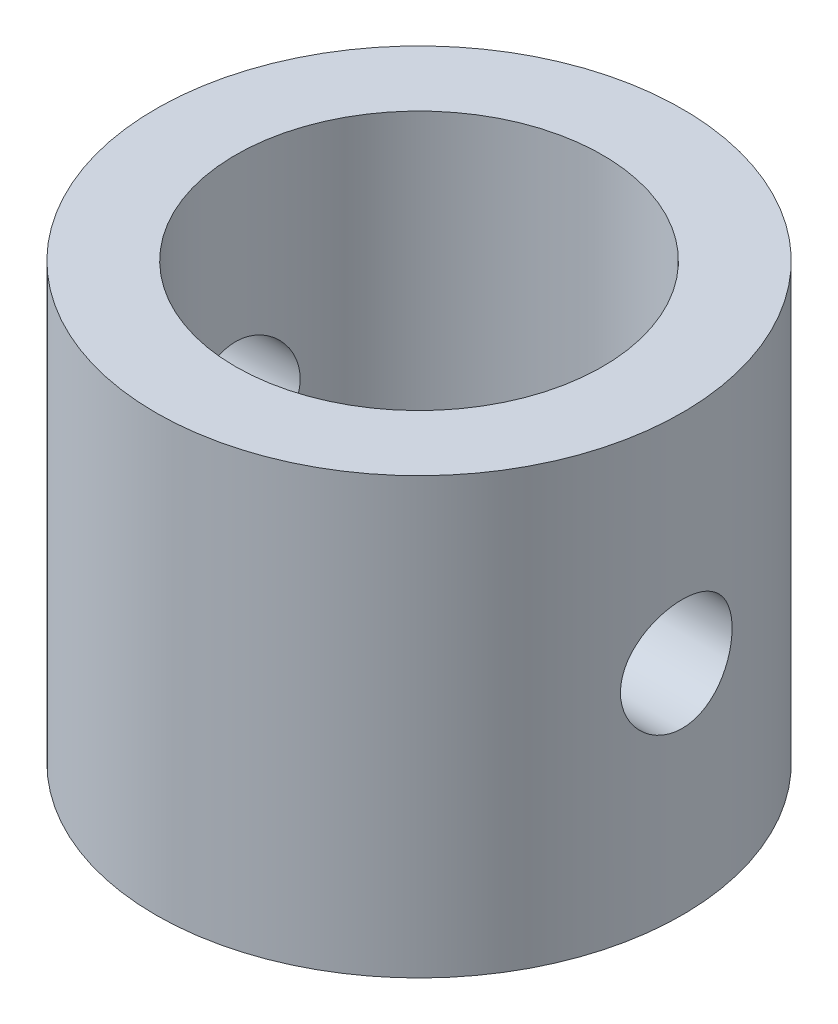
ISO-10303-21;
HEADER;
FILE_DESCRIPTION(('STEP AP214'),'2;1');
FILE_NAME('part.step','',(''),(''),'','','');
FILE_SCHEMA(('AUTOMOTIVE_DESIGN { 1 0 10303 214 1 1 1 1 }'));
ENDSEC;
DATA;
#1=APPLICATION_CONTEXT('core data for automotive mechanical design processes');
#2=APPLICATION_PROTOCOL_DEFINITION('international standard','automotive_design',2000,#1);
#3=PRODUCT_CONTEXT('',#1,'mechanical');
#4=PRODUCT('Part','Part','',(#3));
#5=PRODUCT_RELATED_PRODUCT_CATEGORY('part','',(#4));
#6=PRODUCT_DEFINITION_FORMATION('','',#4);
#7=PRODUCT_DEFINITION_CONTEXT('part definition',#1,'design');
#8=PRODUCT_DEFINITION('design','',#6,#7);
#9=PRODUCT_DEFINITION_SHAPE('','',#8);
#10=(LENGTH_UNIT() NAMED_UNIT(*) SI_UNIT(.MILLI.,.METRE.));
#11=(NAMED_UNIT(*) PLANE_ANGLE_UNIT() SI_UNIT($,.RADIAN.));
#12=(NAMED_UNIT(*) SI_UNIT($,.STERADIAN.) SOLID_ANGLE_UNIT());
#13=UNCERTAINTY_MEASURE_WITH_UNIT(LENGTH_MEASURE(1.E-05),#10,'distance_accuracy_value','');
#14=(GEOMETRIC_REPRESENTATION_CONTEXT(3) GLOBAL_UNCERTAINTY_ASSIGNED_CONTEXT((#13)) GLOBAL_UNIT_ASSIGNED_CONTEXT((#10,
#11,#12)) REPRESENTATION_CONTEXT('',''));
#15=CARTESIAN_POINT('',(0.,0.,0.));
#16=DIRECTION('',(0.,0.,1.));
#17=DIRECTION('',(1.,0.,0.));
#18=AXIS2_PLACEMENT_3D('',#15,#16,#17);
#19=CARTESIAN_POINT('',(0.,38.1,0.));
#20=DIRECTION('',(0.,1.,0.));
#21=DIRECTION('',(0.,0.,1.));
#22=AXIS2_PLACEMENT_3D('',#19,#20,#21);
#23=PLANE('',#22);
#24=CARTESIAN_POINT('',(0.,38.1,0.));
#25=DIRECTION('',(0.,1.,0.));
#26=DIRECTION('',(0.,0.,1.));
#27=AXIS2_PLACEMENT_3D('',#24,#25,#26);
#28=CIRCLE('',#27,23.0505);
#29=CARTESIAN_POINT('',(0.,38.1,23.0505));
#30=VERTEX_POINT('',#29);
#31=EDGE_CURVE('E10',#30,#30,#28,.T.);
#32=ORIENTED_EDGE('',*,*,#31,.T.);
#33=EDGE_LOOP('',(#32));
#34=FACE_BOUND('',#33,.T.);
#35=CARTESIAN_POINT('',(0.,38.1,0.));
#36=DIRECTION('',(0.,1.,0.));
#37=DIRECTION('',(0.,0.,1.));
#38=AXIS2_PLACEMENT_3D('',#35,#36,#37);
#39=CIRCLE('',#38,16.0655);
#40=CARTESIAN_POINT('',(0.,38.1,16.0655));
#41=VERTEX_POINT('',#40);
#42=EDGE_CURVE('E64',#41,#41,#39,.T.);
#43=ORIENTED_EDGE('',*,*,#42,.F.);
#44=EDGE_LOOP('',(#43));
#45=FACE_BOUND('',#44,.T.);
#46=ADVANCED_FACE('F43',(#34,#45),#23,.T.);
#47=CARTESIAN_POINT('',(0.,0.,0.));
#48=DIRECTION('',(0.,1.,0.));
#49=DIRECTION('',(0.,0.,1.));
#50=AXIS2_PLACEMENT_3D('',#47,#48,#49);
#51=PLANE('',#50);
#52=CARTESIAN_POINT('',(0.,0.,0.));
#53=DIRECTION('',(0.,1.,0.));
#54=DIRECTION('',(0.,0.,1.));
#55=AXIS2_PLACEMENT_3D('',#52,#53,#54);
#56=CIRCLE('',#55,23.0505);
#57=CARTESIAN_POINT('',(0.,0.,23.0505));
#58=VERTEX_POINT('',#57);
#59=EDGE_CURVE('E58',#58,#58,#56,.T.);
#60=ORIENTED_EDGE('',*,*,#59,.F.);
#61=EDGE_LOOP('',(#60));
#62=FACE_BOUND('',#61,.T.);
#63=CARTESIAN_POINT('',(0.,0.,0.));
#64=DIRECTION('',(0.,1.,0.));
#65=DIRECTION('',(0.,0.,1.));
#66=AXIS2_PLACEMENT_3D('',#63,#64,#65);
#67=CIRCLE('',#66,16.0655);
#68=CARTESIAN_POINT('',(0.,0.,16.0655));
#69=VERTEX_POINT('',#68);
#70=EDGE_CURVE('E67',#69,#69,#67,.T.);
#71=ORIENTED_EDGE('',*,*,#70,.T.);
#72=EDGE_LOOP('',(#71));
#73=FACE_BOUND('',#72,.T.);
#74=ADVANCED_FACE('F108',(#62,#73),#51,.F.);
#75=CARTESIAN_POINT('',(0.,38.1,0.));
#76=DIRECTION('',(0.,-1.,0.));
#77=DIRECTION('',(0.,0.,-1.));
#78=AXIS2_PLACEMENT_3D('',#75,#76,#77);
#79=CYLINDRICAL_SURFACE('',#78,23.0505);
#80=CARTESIAN_POINT('',(-23.0505,14.1605,0.));
#81=CARTESIAN_POINT('',(-23.0504949770589,14.1605095407336,-0.271386939565896));
#82=CARTESIAN_POINT('',(-23.0456583246257,14.1831709095378,-0.542891051464369));
#83=CARTESIAN_POINT('',(-23.0268308858526,14.2731315662819,-1.07820092463956));
#84=CARTESIAN_POINT('',(-23.0128332933734,14.3404640432243,-1.34200080970285));
#85=CARTESIAN_POINT('',(-22.9772441346323,14.5175739398568,-1.85408729516947));
#86=CARTESIAN_POINT('',(-22.9556602656425,14.6273083484008,-2.10238932059322));
#87=CARTESIAN_POINT('',(-22.9072341531174,14.8859737414636,-2.5770461720956));
#88=CARTESIAN_POINT('',(-22.8803921092448,15.0349032377453,-2.80340183103102));
#89=CARTESIAN_POINT('',(-22.8239406679435,15.3701193307438,-3.23117989602164));
#90=CARTESIAN_POINT('',(-22.7942986613899,15.5568854217527,-3.43222229140937));
#91=CARTESIAN_POINT('',(-22.7358205799909,15.9614432033523,-3.80037357137113));
#92=CARTESIAN_POINT('',(-22.7069845738424,16.1792375289533,-3.9674795710388));
#93=CARTESIAN_POINT('',(-22.6530630748633,16.6424515392782,-4.26466974708744));
#94=CARTESIAN_POINT('',(-22.6280194317526,16.888133512225,-4.39435337828346));
#95=CARTESIAN_POINT('',(-22.5849845238726,17.3984209857963,-4.61044947399683));
#96=CARTESIAN_POINT('',(-22.5669924695549,17.663024363914,-4.696866783235));
#97=CARTESIAN_POINT('',(-22.5404292188594,18.1995332726073,-4.82272928511857));
#98=CARTESIAN_POINT('',(-22.5317236576423,18.4712746798582,-4.86284512535372));
#99=CARTESIAN_POINT('',(-22.5243152191168,19.0177594673615,-4.8970504545545));
#100=CARTESIAN_POINT('',(-22.5256111877945,19.2925024976224,-4.89114525359826));
#101=CARTESIAN_POINT('',(-22.5379375729264,19.8322347509422,-4.83401673936722));
#102=CARTESIAN_POINT('',(-22.5488014397806,20.097310415709,-4.78356875000218));
#103=CARTESIAN_POINT('',(-22.5787766099479,20.6151482928414,-4.64001339785437));
#104=CARTESIAN_POINT('',(-22.5978883511768,20.8679098506039,-4.54690376996179));
#105=CARTESIAN_POINT('',(-22.6423722070027,21.3561439641243,-4.31994602764773));
#106=CARTESIAN_POINT('',(-22.6677903723031,21.5914720239821,-4.18579647301888));
#107=CARTESIAN_POINT('',(-22.7219943756099,22.0365655527615,-3.88077910495418));
#108=CARTESIAN_POINT('',(-22.750780646496,22.2463277287843,-3.7099065693954));
#109=CARTESIAN_POINT('',(-22.8091944995257,22.6388025902253,-3.3321724612221));
#110=CARTESIAN_POINT('',(-22.8388272974925,22.820879701759,-3.12465070287757));
#111=CARTESIAN_POINT('',(-22.8950621003693,23.1477465721683,-2.68168734801867));
#112=CARTESIAN_POINT('',(-22.9216640565235,23.2925357312565,-2.44624530248737));
#113=CARTESIAN_POINT('',(-22.9689182954533,23.5408593073074,-1.95337426340312));
#114=CARTESIAN_POINT('',(-22.9895591028924,23.6443142999237,-1.69590408346811));
#115=CARTESIAN_POINT('',(-23.0224795079581,23.8063186785154,-1.16670030925203));
#116=CARTESIAN_POINT('',(-23.034760247561,23.8648741978486,-0.89496866853526));
#117=CARTESIAN_POINT('',(-23.0494155346004,23.9345019518898,-0.350410783805504));
#118=CARTESIAN_POINT('',(-23.0519713058633,23.9464429541741,-0.0777003556555921));
#119=CARTESIAN_POINT('',(-23.0473949072729,23.9248520087622,0.465818570116066));
#120=CARTESIAN_POINT('',(-23.0402633534829,23.8913229527253,0.736627187582213));
#121=CARTESIAN_POINT('',(-23.0172276315168,23.7804646031387,1.26580418296187));
#122=CARTESIAN_POINT('',(-23.0014140541729,23.7035873969781,1.52427156144745));
#123=CARTESIAN_POINT('',(-22.9627828438024,23.5087139839373,2.02464440628262));
#124=CARTESIAN_POINT('',(-22.9399646391297,23.3907144209652,2.26654851893673));
#125=CARTESIAN_POINT('',(-22.8894064502927,23.1151107112667,2.73054644766998));
#126=CARTESIAN_POINT('',(-22.861603966115,22.9569915926846,2.9523274238252));
#127=CARTESIAN_POINT('',(-22.8042954684844,22.60631941096,3.36651977064085));
#128=CARTESIAN_POINT('',(-22.774789248142,22.4137621599158,3.55892756405001));
#129=CARTESIAN_POINT('',(-22.7167782750143,21.9957041560598,3.91231713042827));
#130=CARTESIAN_POINT('',(-22.6882996000408,21.7696921320259,4.07269912616962));
#131=CARTESIAN_POINT('',(-22.6361521501696,21.2934284994969,4.35322958216634));
#132=CARTESIAN_POINT('',(-22.6124831719026,21.043177916546,4.47337974369054));
#133=CARTESIAN_POINT('',(-22.5728520318292,20.5268596077218,4.66925024305476));
#134=CARTESIAN_POINT('',(-22.5568476834169,20.2608877322513,4.74521429243224));
#135=CARTESIAN_POINT('',(-22.5342766863117,19.7195741657256,4.85128007048469));
#136=CARTESIAN_POINT('',(-22.5277086309418,19.4442338774945,4.88138863492038));
#137=CARTESIAN_POINT('',(-22.5248387383762,18.8980371771086,4.89461142319629));
#138=CARTESIAN_POINT('',(-22.528329420591,18.6272044098993,4.87867538616666));
#139=CARTESIAN_POINT('',(-22.5447165126656,18.0921762722278,4.80237472728237));
#140=CARTESIAN_POINT('',(-22.5576128250438,17.8279808330044,4.74201056588875));
#141=CARTESIAN_POINT('',(-22.5912599353655,17.3144269584999,4.57901351533237));
#142=CARTESIAN_POINT('',(-22.6119864937351,17.0650254557093,4.47651098565466));
#143=CARTESIAN_POINT('',(-22.6589697145536,16.5868158300016,4.23226189323349));
#144=CARTESIAN_POINT('',(-22.68522691311,16.3580097065498,4.09051152561749));
#145=CARTESIAN_POINT('',(-22.7409381448753,15.9227866348941,3.76860647907971));
#146=CARTESIAN_POINT('',(-22.7704435494743,15.7168792417732,3.58777163218437));
#147=CARTESIAN_POINT('',(-22.82897317339,15.338019942417,3.19421889407462));
#148=CARTESIAN_POINT('',(-22.8579972802257,15.1650756433793,2.98149366340904));
#149=CARTESIAN_POINT('',(-22.9127078587398,14.8550670706509,2.52711398767802));
#150=CARTESIAN_POINT('',(-22.9383499263098,14.7184599778263,2.28514200344844));
#151=CARTESIAN_POINT('',(-22.9829651501228,14.4880694910969,1.78118595896855));
#152=CARTESIAN_POINT('',(-23.0019440487762,14.3942492019827,1.51921936858866));
#153=CARTESIAN_POINT('',(-23.027598461094,14.269345217341,1.04739032960189));
#154=CARTESIAN_POINT('',(-23.036134419419,14.228604259285,0.840131043816881));
#155=CARTESIAN_POINT('',(-23.0475870305857,14.174178475914,0.421938019098005));
#156=CARTESIAN_POINT('',(-23.0505039053567,14.1604925820417,0.211004425615266));
#157=CARTESIAN_POINT('',(-23.0505,14.1605,0.));
#158=B_SPLINE_CURVE_WITH_KNOTS('',3,(#80,#81,#82,#83,#84,#85,#86,#87,#88,#89,#90,#91,#92,#93,
#94,#95,#96,#97,#98,#99,#100,#101,#102,#103,#104,#105,#106,#107,#108,#109,#110,#111,#112,#113,
#114,#115,#116,#117,#118,#119,#120,#121,#122,#123,#124,#125,#126,#127,#128,#129,#130,#131,#132,
#133,#134,#135,#136,#137,#138,#139,#140,#141,#142,#143,#144,#145,#146,#147,#148,#149,#150,#151,
#152,#153,#154,#155,#156,#157),.UNSPECIFIED.,.T.,.F.,(4,2,2,2,2,2,2,2,2,2,2,2,2,2,2,2,2,2,2,2,2,
2,2,2,2,2,2,2,2,2,2,2,2,2,2,2,2,2,4),(0.,0.813388620958388,1.62738223773515,2.44055232416864,
3.2536915389981,4.07786463917974,4.90210777236939,5.73487099941289,6.56754095741949,
7.38799256628106,8.20834950979958,9.01470254495505,9.82109839820023,10.6335655676917,
11.446137273027,12.2752048312345,13.1042857244,13.934952136872,14.7655050584275,
15.5805026831125,16.3954484806166,17.2020481856775,18.0087137346526,18.8263094857228,
19.6440047294573,20.4758143461772,21.3075887840253,22.1347309125639,22.9617497254444,
23.7718325759099,24.5819070306495,25.3894940711297,26.1971594303766,27.0202109959561,
27.8434522753679,28.6766077455587,29.5090434181313,30.1414812872037,30.7738941772339),.UNSPECIFIED.);
#159=CARTESIAN_POINT('',(-23.0505,14.1605,0.));
#160=VERTEX_POINT('',#159);
#161=EDGE_CURVE('E94',#160,#160,#158,.T.);
#162=ORIENTED_EDGE('',*,*,#161,.T.);
#163=EDGE_LOOP('',(#162));
#164=FACE_BOUND('',#163,.T.);
#165=CARTESIAN_POINT('',(22.5259481487462,19.05,-4.8895));
#166=CARTESIAN_POINT('',(22.5259536199286,18.7786904932384,-4.88949040229845));
#167=CARTESIAN_POINT('',(22.5309031059826,18.5072636689726,-4.86684152459317));
#168=CARTESIAN_POINT('',(22.550132548665,17.9721142438412,-4.77693497564059));
#169=CARTESIAN_POINT('',(22.5644195111736,17.7083975832276,-4.70964380884657));
#170=CARTESIAN_POINT('',(22.6006346781616,17.1964874104774,-4.53265467146385));
#171=CARTESIAN_POINT('',(22.6225547809901,16.9482777676561,-4.42300164938858));
#172=CARTESIAN_POINT('',(22.6715566806668,16.4737768410252,-4.1645281417949));
#173=CARTESIAN_POINT('',(22.698638305765,16.247484828283,-4.01570895946996));
#174=CARTESIAN_POINT('',(22.7553927168847,15.819639629894,-3.68060628611495));
#175=CARTESIAN_POINT('',(22.7850969626392,15.6184855233841,-3.49381850988731));
#176=CARTESIAN_POINT('',(22.843473750261,15.2501172889899,-3.0891698476784));
#177=CARTESIAN_POINT('',(22.8721462147237,15.0829057031349,-2.8713066364691));
#178=CARTESIAN_POINT('',(22.9255702638534,14.7856012311907,-2.40802759152199));
#179=CARTESIAN_POINT('',(22.9502804077272,14.6558905322012,-2.16236130375213));
#180=CARTESIAN_POINT('',(22.9926409976042,14.4397401270187,-1.65210769983946));
#181=CARTESIAN_POINT('',(23.0102921879113,14.3532958585237,-1.38752238200976));
#182=CARTESIAN_POINT('',(23.0363237660923,14.2273826929001,-0.851088118604617));
#183=CARTESIAN_POINT('',(23.0448372180262,14.1872389039323,-0.579404150955835));
#184=CARTESIAN_POINT('',(23.0520945824819,14.1529577468146,-0.0330332641617767));
#185=CARTESIAN_POINT('',(23.0508395488225,14.1588154160535,0.241653327869482));
#186=CARTESIAN_POINT('',(23.0388035572076,14.2158649033246,0.781585046570949));
#187=CARTESIAN_POINT('',(23.0281754243471,14.2663294518085,1.0469109229581));
#188=CARTESIAN_POINT('',(22.9987608842737,14.4100032181945,1.56524049962666));
#189=CARTESIAN_POINT('',(22.9799741229541,14.5032142914221,1.81824366453868));
#190=CARTESIAN_POINT('',(22.9361052234492,14.7303894630101,2.30678508884283));
#191=CARTESIAN_POINT('',(22.9109801962551,14.8646325775818,2.54218959488266));
#192=CARTESIAN_POINT('',(22.8571951184324,15.1698537001212,2.98739713475451));
#193=CARTESIAN_POINT('',(22.8285346133295,15.3408364329498,3.19719687026472));
#194=CARTESIAN_POINT('',(22.7701729133765,15.7186537766052,3.58956159144597));
#195=CARTESIAN_POINT('',(22.740462329883,15.9261249236367,3.77151275812627));
#196=CARTESIAN_POINT('',(22.6838772440909,16.3689404780127,4.09814894418832));
#197=CARTESIAN_POINT('',(22.6570028097264,16.6042855527328,4.2428330710351));
#198=CARTESIAN_POINT('',(22.6091102254928,17.097120439898,4.49107855054828));
#199=CARTESIAN_POINT('',(22.5881077772864,17.3546672615293,4.59452995523236));
#200=CARTESIAN_POINT('',(22.554558978258,17.8840390046633,4.75650416813251));
#201=CARTESIAN_POINT('',(22.5420113738277,18.1558618030072,4.81503363714847));
#202=CARTESIAN_POINT('',(22.5270470210878,18.7004771750692,4.88456307317736));
#203=CARTESIAN_POINT('',(22.5244403633189,18.9731508976574,4.89645413624761));
#204=CARTESIAN_POINT('',(22.5291416689905,19.5165848367812,4.87477644430964));
#205=CARTESIAN_POINT('',(22.536448994851,19.7873451752431,4.84121061268862));
#206=CARTESIAN_POINT('',(22.5599761154538,20.3162028391946,4.73034333137789));
#207=CARTESIAN_POINT('',(22.576096925461,20.5744067426668,4.65352734567553));
#208=CARTESIAN_POINT('',(22.6153462201289,21.0742794231858,4.45886353155236));
#209=CARTESIAN_POINT('',(22.6384753422816,21.315946693571,4.34101197029771));
#210=CARTESIAN_POINT('',(22.6895558417142,21.7797578888025,4.06563967896026));
#211=CARTESIAN_POINT('',(22.7175724669096,22.0015667115857,3.90756688141392));
#212=CARTESIAN_POINT('',(22.7750966443622,22.4158364624176,3.55696646909293));
#213=CARTESIAN_POINT('',(22.804604369939,22.608293968292,3.36443484232053));
#214=CARTESIAN_POINT('',(22.8624084994217,22.9618275847721,2.94636121446729));
#215=CARTESIAN_POINT('',(22.8906748092694,23.1222979738519,2.72030214526498));
#216=CARTESIAN_POINT('',(22.9422688711443,23.4029834092965,2.24391729145687));
#217=CARTESIAN_POINT('',(22.9655968460411,23.5232002724666,1.99359260271494));
#218=CARTESIAN_POINT('',(23.0045583139972,23.719108252421,1.47729185431355));
#219=CARTESIAN_POINT('',(23.0202387231247,23.7950714295722,1.2114227267217));
#220=CARTESIAN_POINT('',(23.0423405812081,23.901170134169,0.67032881283735));
#221=CARTESIAN_POINT('',(23.0487632919818,23.9313119070702,0.395105306775205));
#222=CARTESIAN_POINT('',(23.0515913832773,23.9446454232171,-0.151121940821028));
#223=CARTESIAN_POINT('',(23.0481902011425,23.9287437691451,-0.422102951921762));
#224=CARTESIAN_POINT('',(23.0321643004093,23.8524602358528,-0.957436831375172));
#225=CARTESIAN_POINT('',(23.019539728812,23.7920790655411,-1.22178980529517));
#226=CARTESIAN_POINT('',(22.9864966884843,23.6289738341324,-1.73571156531001));
#227=CARTESIAN_POINT('',(22.9661005986437,23.5263712866291,-1.98532044670596));
#228=CARTESIAN_POINT('',(22.9196989700329,23.2818571225777,-2.46390408981144));
#229=CARTESIAN_POINT('',(22.8936929224008,23.1399419397706,-2.69287697702107));
#230=CARTESIAN_POINT('',(22.8383314759543,22.8178377243665,-3.1281334990531));
#231=CARTESIAN_POINT('',(22.8089243108678,22.6370070632601,-3.33393577093322));
#232=CARTESIAN_POINT('',(22.7503639508534,22.2435081733647,-3.71258494001374));
#233=CARTESIAN_POINT('',(22.721210818386,22.0308323360411,-3.88542393904155));
#234=CARTESIAN_POINT('',(22.6660578953168,21.5765088961549,-4.19529665043822));
#235=CARTESIAN_POINT('',(22.6401017194405,21.3345345570805,-4.33185948400874));
#236=CARTESIAN_POINT('',(22.5948239543629,20.8305781234374,-4.56216660557884));
#237=CARTESIAN_POINT('',(22.5754966061979,20.5686136389786,-4.65594808447765));
#238=CARTESIAN_POINT('',(22.549342172291,20.0968830907333,-4.78076089875671));
#239=CARTESIAN_POINT('',(22.5406262192759,19.8897258436386,-4.82146179304738));
#240=CARTESIAN_POINT('',(22.5289272047349,19.4717359224621,-4.87583449060934));
#241=CARTESIAN_POINT('',(22.5259438957031,19.260903407456,-4.88950746080734));
#242=CARTESIAN_POINT('',(22.5259481487462,19.05,-4.8895));
#243=B_SPLINE_CURVE_WITH_KNOTS('',3,(#165,#166,#167,#168,#169,#170,#171,#172,#173,#174,#175,
#176,#177,#178,#179,#180,#181,#182,#183,#184,#185,#186,#187,#188,#189,#190,#191,#192,#193,#194,
#195,#196,#197,#198,#199,#200,#201,#202,#203,#204,#205,#206,#207,#208,#209,#210,#211,#212,#213,
#214,#215,#216,#217,#218,#219,#220,#221,#222,#223,#224,#225,#226,#227,#228,#229,#230,#231,#232,
#233,#234,#235,#236,#237,#238,#239,#240,#241,#242),.UNSPECIFIED.,.T.,.F.,(4,2,2,2,2,2,2,2,2,2,2,
2,2,2,2,2,2,2,2,2,2,2,2,2,2,2,2,2,2,2,2,2,2,2,2,2,2,2,4),(0.,0.813155846247462,1.62692250236293,
2.43982806346272,3.25270657980499,4.07718423616601,4.90172361669068,5.73439174114735,
6.56697204499791,7.38725656834125,8.2074526010709,9.01451786489851,9.82161816105791,
10.6343336343416,11.4471536886887,12.2758917476878,13.1046496528816,13.935602907613,
14.7664329289375,15.5813090703925,16.3961328086779,17.2019877930162,18.0079161017548,
18.8255668985667,19.6433129554251,20.475318214077,21.3072859158841,22.1340833951581,
22.9607681718639,23.7712867483521,24.5817924071843,25.3899815571406,26.1982440462711,
27.0210230894175,27.8439990277277,28.6771863852776,29.5096480454793,30.1417849199577,
30.7738945014218),.UNSPECIFIED.);
#244=CARTESIAN_POINT('',(22.5259481487462,19.05,-4.8895));
#245=VERTEX_POINT('',#244);
#246=EDGE_CURVE('E88',#245,#245,#243,.T.);
#247=ORIENTED_EDGE('',*,*,#246,.T.);
#248=EDGE_LOOP('',(#247));
#249=FACE_BOUND('',#248,.T.);
#250=ORIENTED_EDGE('',*,*,#31,.F.);
#251=EDGE_LOOP('',(#250));
#252=FACE_BOUND('',#251,.T.);
#253=ORIENTED_EDGE('',*,*,#59,.T.);
#254=EDGE_LOOP('',(#253));
#255=FACE_BOUND('',#254,.T.);
#256=ADVANCED_FACE('F45',(#164,#249,#252,#255),#79,.T.);
#257=CARTESIAN_POINT('',(0.,38.1,0.));
#258=DIRECTION('',(0.,-1.,0.));
#259=DIRECTION('',(0.,0.,-1.));
#260=AXIS2_PLACEMENT_3D('',#257,#258,#259);
#261=CYLINDRICAL_SURFACE('',#260,16.0655);
#262=CARTESIAN_POINT('',(-15.3033682566943,19.05,-4.8895));
#263=CARTESIAN_POINT('',(-15.3033706667856,19.3177277573081,-4.8894971708858));
#264=CARTESIAN_POINT('',(-15.3104708578242,19.5854835137223,-4.86743584751662));
#265=CARTESIAN_POINT('',(-15.337986872051,20.1131538075418,-4.78000939684164));
#266=CARTESIAN_POINT('',(-15.3584068485064,20.3730658727345,-4.71463076258372));
#267=CARTESIAN_POINT('',(-15.4100400944335,20.8773320640204,-4.54300575976151));
#268=CARTESIAN_POINT('',(-15.4412350110894,21.121711813434,-4.43682884801411));
#269=CARTESIAN_POINT('',(-15.5108781877863,21.5892524560916,-4.18685073303388));
#270=CARTESIAN_POINT('',(-15.5493276016045,21.812409965584,-4.04304354355879));
#271=CARTESIAN_POINT('',(-15.6305522152295,22.2384409101865,-3.7168711105988));
#272=CARTESIAN_POINT('',(-15.6734216100975,22.4405210305679,-3.53349289504905));
#273=CARTESIAN_POINT('',(-15.7578523156117,22.8115877918701,-3.13555354317669));
#274=CARTESIAN_POINT('',(-15.7994134526135,22.9805700551449,-2.92098828846926));
#275=CARTESIAN_POINT('',(-15.8776173679463,23.2841083621737,-2.46110237456125));
#276=CARTESIAN_POINT('',(-15.9141362532305,23.4178527436505,-2.21522307962491));
#277=CARTESIAN_POINT('',(-15.9770446675155,23.6417845521324,-1.70316186174078));
#278=CARTESIAN_POINT('',(-16.0034364479973,23.7319816618184,-1.43698446730533));
#279=CARTESIAN_POINT('',(-16.0424504389809,23.8636251599365,-0.900184773441872));
#280=CARTESIAN_POINT('',(-16.0554545012576,23.9064262821989,-0.629922961589964));
#281=CARTESIAN_POINT('',(-16.0675739306402,23.9463495085259,-0.0857622981180836));
#282=CARTESIAN_POINT('',(-16.0666922972564,23.9434814777839,0.188135755249017));
#283=CARTESIAN_POINT('',(-16.0514082011637,23.893050916855,0.722279271405512));
#284=CARTESIAN_POINT('',(-16.0374497227239,23.8469559728685,0.982678010574176));
#285=CARTESIAN_POINT('',(-15.9981221467943,23.7137810489784,1.49185144079783));
#286=CARTESIAN_POINT('',(-15.9727523188512,23.6266984453923,1.74062538661131));
#287=CARTESIAN_POINT('',(-15.9128449619812,23.4130439697881,2.22294076060444));
#288=CARTESIAN_POINT('',(-15.8782023002964,23.2860161249194,2.45626660693365));
#289=CARTESIAN_POINT('',(-15.803415384505,22.9964394417007,2.89875551423917));
#290=CARTESIAN_POINT('',(-15.7632697959785,22.8338819819745,3.10791269174612));
#291=CARTESIAN_POINT('',(-15.6798878012244,22.470275310862,3.50488301557654));
#292=CARTESIAN_POINT('',(-15.6365919555836,22.26795609657,3.69152199060917));
#293=CARTESIAN_POINT('',(-15.5531738257658,21.8344742008031,4.02856036169522));
#294=CARTESIAN_POINT('',(-15.513051876732,21.6033084799475,4.17895593410035));
#295=CARTESIAN_POINT('',(-15.4402347620891,21.1155265855717,4.440511032547));
#296=CARTESIAN_POINT('',(-15.4076188837345,20.8586764799131,4.55125798890022));
#297=CARTESIAN_POINT('',(-15.3544437170935,20.3287456753759,4.72757089595248));
#298=CARTESIAN_POINT('',(-15.333880360184,20.0556704879943,4.79315209476605));
#299=CARTESIAN_POINT('',(-15.3080349563144,19.5122418352768,4.87505293792472));
#300=CARTESIAN_POINT('',(-15.3021981471041,19.2421842377959,4.89316197704074));
#301=CARTESIAN_POINT('',(-15.3049305291717,18.7028776619745,4.88461052959574));
#302=CARTESIAN_POINT('',(-15.3134976329736,18.4336285721266,4.85795653028429));
#303=CARTESIAN_POINT('',(-15.3435269445965,17.9111276847523,4.76223115033374));
#304=CARTESIAN_POINT('',(-15.3646350842974,17.6576402807645,4.69432333668392));
#305=CARTESIAN_POINT('',(-15.4169984210627,17.1656782885636,4.51937297970934));
#306=CARTESIAN_POINT('',(-15.4482552156141,16.9272060709323,4.41232427493163));
#307=CARTESIAN_POINT('',(-15.5184612538236,16.4647952805915,4.15876907495115));
#308=CARTESIAN_POINT('',(-15.5575982792481,16.2414361602433,4.01125913526422));
#309=CARTESIAN_POINT('',(-15.6387567076826,15.8219882784716,3.6821534046289));
#310=CARTESIAN_POINT('',(-15.6807788197648,15.625906257076,3.50054921512373));
#311=CARTESIAN_POINT('',(-15.7649560952809,15.2586952479024,3.09997892137043));
#312=CARTESIAN_POINT('',(-15.8070525199119,15.0888378249834,2.87983183263165));
#313=CARTESIAN_POINT('',(-15.8849890892595,14.7884387002636,2.41315028144019));
#314=CARTESIAN_POINT('',(-15.9208295373617,14.6578950917045,2.16661709952499));
#315=CARTESIAN_POINT('',(-15.9820013986162,14.4410882068034,1.65575704920208));
#316=CARTESIAN_POINT('',(-16.0074103573755,14.3544970136865,1.39157910602035));
#317=CARTESIAN_POINT('',(-16.0451984110525,14.2272358742047,0.851506316645557));
#318=CARTESIAN_POINT('',(-16.0575813532689,14.1865523685176,0.575614955128961));
#319=CARTESIAN_POINT('',(-16.0676807994051,14.1533169656799,0.0316818996142313));
#320=CARTESIAN_POINT('',(-16.0659584458871,14.158923609687,-0.236238234594924));
#321=CARTESIAN_POINT('',(-16.0493707884827,14.2136896996036,-0.767150608512067));
#322=CARTESIAN_POINT('',(-16.034506267524,14.2628465510658,-1.03014314082251));
#323=CARTESIAN_POINT('',(-15.9934705518423,14.402166393764,-1.5408233529251));
#324=CARTESIAN_POINT('',(-15.9674293964506,14.4918583790901,-1.78865069796292));
#325=CARTESIAN_POINT('',(-15.9067303616722,14.7092798811385,-2.26586539484392));
#326=CARTESIAN_POINT('',(-15.8720710438054,14.8370157485691,-2.49524965983748));
#327=CARTESIAN_POINT('',(-15.7963601608694,15.1317338452241,-2.93721578806807));
#328=CARTESIAN_POINT('',(-15.7551367435555,15.2998619949133,-3.14900380812676));
#329=CARTESIAN_POINT('',(-15.6714756193766,15.6685431919674,-3.54197492729746));
#330=CARTESIAN_POINT('',(-15.629037561135,15.8691057017275,-3.72314906348234));
#331=CARTESIAN_POINT('',(-15.5462017923938,16.3044057664354,-4.05538828244856));
#332=CARTESIAN_POINT('',(-15.5059078219158,16.5400086386706,-4.205348476468));
#333=CARTESIAN_POINT('',(-15.4336228170539,17.0342608872194,-4.46336565767229));
#334=CARTESIAN_POINT('',(-15.4016280085673,17.2928997156289,-4.57144170305726));
#335=CARTESIAN_POINT('',(-15.3525423541252,17.7992145868916,-4.73351632025267));
#336=CARTESIAN_POINT('',(-15.334280131621,18.0453960653191,-4.79184542261853));
#337=CARTESIAN_POINT('',(-15.3096932309011,18.5443776649089,-4.86983443269058));
#338=CARTESIAN_POINT('',(-15.3033659807702,18.7971763481954,-4.88950267162057));
#339=CARTESIAN_POINT('',(-15.3033682566943,19.05,-4.8895));
#340=B_SPLINE_CURVE_WITH_KNOTS('',3,(#262,#263,#264,#265,#266,#267,#268,#269,#270,#271,#272,
#273,#274,#275,#276,#277,#278,#279,#280,#281,#282,#283,#284,#285,#286,#287,#288,#289,#290,#291,
#292,#293,#294,#295,#296,#297,#298,#299,#300,#301,#302,#303,#304,#305,#306,#307,#308,#309,#310,
#311,#312,#313,#314,#315,#316,#317,#318,#319,#320,#321,#322,#323,#324,#325,#326,#327,#328,#329,
#330,#331,#332,#333,#334,#335,#336,#337,#338,#339),.UNSPECIFIED.,.T.,.F.,(4,2,2,2,2,2,2,2,2,2,2,
2,2,2,2,2,2,2,2,2,2,2,2,2,2,2,2,2,2,2,2,2,2,2,2,2,2,2,4),(0.,0.802250201823944,1.60475067444441,
2.40589094445038,3.20715873778834,4.03208145585099,4.8571132077009,5.69975218675846,
6.54220371971679,7.35989831896473,8.17741628682426,8.96814660334769,9.7589275426075,
10.5590845898079,11.3594360136942,12.1915015289398,13.0236547880011,13.8642313713218,
14.7045240338131,15.5126548055432,16.3206684696373,17.1068866407936,17.8932286296048,
18.7011788811462,19.5093284196866,20.3489989184325,21.1886286857826,22.0218985765638,
22.8549222877778,23.6549722570312,24.4549745675509,25.2459110259627,26.0369795903673,
26.8538943618601,27.6710478913205,28.513481770302,29.355531872179,30.1132850104059,
30.8708748386905),.UNSPECIFIED.);
#341=CARTESIAN_POINT('',(-15.3033682566943,19.05,-4.8895));
#342=VERTEX_POINT('',#341);
#343=EDGE_CURVE('E48',#342,#342,#340,.T.);
#344=ORIENTED_EDGE('',*,*,#343,.F.);
#345=EDGE_LOOP('',(#344));
#346=FACE_BOUND('',#345,.T.);
#347=CARTESIAN_POINT('',(15.3033682566943,19.05,-4.8895));
#348=CARTESIAN_POINT('',(15.3033706667856,18.7822722426919,-4.8894971708858));
#349=CARTESIAN_POINT('',(15.3104708578242,18.5145164862777,-4.86743584751662));
#350=CARTESIAN_POINT('',(15.337986872051,17.9868461924582,-4.78000939684164));
#351=CARTESIAN_POINT('',(15.3584068485064,17.7269341272655,-4.71463076258372));
#352=CARTESIAN_POINT('',(15.4100400944335,17.2226679359796,-4.54300575976151));
#353=CARTESIAN_POINT('',(15.4412350110894,16.978288186566,-4.43682884801411));
#354=CARTESIAN_POINT('',(15.5108781877863,16.5107475439084,-4.18685073303388));
#355=CARTESIAN_POINT('',(15.5493276016045,16.287590034416,-4.04304354355879));
#356=CARTESIAN_POINT('',(15.6305522152295,15.8615590898135,-3.7168711105988));
#357=CARTESIAN_POINT('',(15.6734216100975,15.6594789694321,-3.53349289504905));
#358=CARTESIAN_POINT('',(15.7578523156117,15.2884122081299,-3.13555354317669));
#359=CARTESIAN_POINT('',(15.7994134526135,15.1194299448551,-2.92098828846926));
#360=CARTESIAN_POINT('',(15.8776173679463,14.8158916378263,-2.46110237456125));
#361=CARTESIAN_POINT('',(15.9141362532305,14.6821472563495,-2.21522307962491));
#362=CARTESIAN_POINT('',(15.9770446675155,14.4582154478676,-1.70316186174078));
#363=CARTESIAN_POINT('',(16.0034364479973,14.3680183381816,-1.43698446730533));
#364=CARTESIAN_POINT('',(16.0424504389809,14.2363748400635,-0.900184773441873));
#365=CARTESIAN_POINT('',(16.0554545012576,14.1935737178011,-0.629922961589965));
#366=CARTESIAN_POINT('',(16.0675739306402,14.1536504914741,-0.0857622981180853));
#367=CARTESIAN_POINT('',(16.0666922972564,14.1565185222161,0.188135755249015));
#368=CARTESIAN_POINT('',(16.0514082011637,14.206949083145,0.72227927140551));
#369=CARTESIAN_POINT('',(16.0374497227239,14.2530440271315,0.982678010574173));
#370=CARTESIAN_POINT('',(15.9981221467943,14.3862189510216,1.49185144079782));
#371=CARTESIAN_POINT('',(15.9727523188512,14.4733015546077,1.74062538661131));
#372=CARTESIAN_POINT('',(15.9128449619812,14.6869560302119,2.22294076060443));
#373=CARTESIAN_POINT('',(15.8782023002964,14.8139838750806,2.45626660693365));
#374=CARTESIAN_POINT('',(15.803415384505,15.1035605582993,2.89875551423917));
#375=CARTESIAN_POINT('',(15.7632697959785,15.2661180180255,3.10791269174611));
#376=CARTESIAN_POINT('',(15.6798878012244,15.629724689138,3.50488301557654));
#377=CARTESIAN_POINT('',(15.6365919555836,15.83204390343,3.69152199060917));
#378=CARTESIAN_POINT('',(15.5531738257658,16.2655257991969,4.02856036169522));
#379=CARTESIAN_POINT('',(15.513051876732,16.4966915200525,4.17895593410034));
#380=CARTESIAN_POINT('',(15.4402347620891,16.9844734144283,4.440511032547));
#381=CARTESIAN_POINT('',(15.4076188837345,17.2413235200869,4.55125798890022));
#382=CARTESIAN_POINT('',(15.3544437170935,17.7712543246241,4.72757089595248));
#383=CARTESIAN_POINT('',(15.333880360184,18.0443295120057,4.79315209476605));
#384=CARTESIAN_POINT('',(15.3080349563144,18.5877581647232,4.87505293792472));
#385=CARTESIAN_POINT('',(15.3021981471041,18.8578157622041,4.89316197704074));
#386=CARTESIAN_POINT('',(15.3049305291717,19.3971223380255,4.88461052959574));
#387=CARTESIAN_POINT('',(15.3134976329736,19.6663714278734,4.85795653028429));
#388=CARTESIAN_POINT('',(15.3435269445965,20.1888723152477,4.76223115033375));
#389=CARTESIAN_POINT('',(15.3646350842974,20.4423597192355,4.69432333668392));
#390=CARTESIAN_POINT('',(15.4169984210627,20.9343217114364,4.51937297970935));
#391=CARTESIAN_POINT('',(15.4482552156141,21.1727939290677,4.41232427493163));
#392=CARTESIAN_POINT('',(15.5184612538236,21.6352047194085,4.15876907495115));
#393=CARTESIAN_POINT('',(15.5575982792481,21.8585638397567,4.01125913526422));
#394=CARTESIAN_POINT('',(15.6387567076826,22.2780117215284,3.6821534046289));
#395=CARTESIAN_POINT('',(15.6807788197648,22.474093742924,3.50054921512373));
#396=CARTESIAN_POINT('',(15.7649560952809,22.8413047520976,3.09997892137043));
#397=CARTESIAN_POINT('',(15.8070525199119,23.0111621750166,2.87983183263165));
#398=CARTESIAN_POINT('',(15.8849890892595,23.3115612997364,2.41315028144019));
#399=CARTESIAN_POINT('',(15.9208295373617,23.4421049082955,2.16661709952499));
#400=CARTESIAN_POINT('',(15.9820013986162,23.6589117931966,1.65575704920208));
#401=CARTESIAN_POINT('',(16.0074103573755,23.7455029863135,1.39157910602035));
#402=CARTESIAN_POINT('',(16.0451984110525,23.8727641257953,0.851506316645558));
#403=CARTESIAN_POINT('',(16.0575813532689,23.9134476314824,0.575614955128962));
#404=CARTESIAN_POINT('',(16.0676807994051,23.9466830343201,0.0316818996142332));
#405=CARTESIAN_POINT('',(16.0659584458871,23.941076390313,-0.236238234594922));
#406=CARTESIAN_POINT('',(16.0493707884827,23.8863103003964,-0.767150608512065));
#407=CARTESIAN_POINT('',(16.034506267524,23.8371534489342,-1.0301431408225));
#408=CARTESIAN_POINT('',(15.9934705518423,23.697833606236,-1.5408233529251));
#409=CARTESIAN_POINT('',(15.9674293964506,23.6081416209099,-1.78865069796292));
#410=CARTESIAN_POINT('',(15.9067303616722,23.3907201188615,-2.26586539484392));
#411=CARTESIAN_POINT('',(15.8720710438054,23.2629842514309,-2.49524965983748));
#412=CARTESIAN_POINT('',(15.7963601608694,22.9682661547759,-2.93721578806806));
#413=CARTESIAN_POINT('',(15.7551367435555,22.8001380050867,-3.14900380812676));
#414=CARTESIAN_POINT('',(15.6714756193766,22.4314568080326,-3.54197492729746));
#415=CARTESIAN_POINT('',(15.629037561135,22.2308942982725,-3.72314906348234));
#416=CARTESIAN_POINT('',(15.5462017923938,21.7955942335646,-4.05538828244856));
#417=CARTESIAN_POINT('',(15.5059078219158,21.5599913613294,-4.205348476468));
#418=CARTESIAN_POINT('',(15.4336228170539,21.0657391127806,-4.46336565767229));
#419=CARTESIAN_POINT('',(15.4016280085673,20.8071002843711,-4.57144170305726));
#420=CARTESIAN_POINT('',(15.3525423541252,20.3007854131084,-4.73351632025267));
#421=CARTESIAN_POINT('',(15.334280131621,20.0546039346809,-4.79184542261853));
#422=CARTESIAN_POINT('',(15.3096932309011,19.5556223350911,-4.86983443269058));
#423=CARTESIAN_POINT('',(15.3033659807702,19.3028236518046,-4.88950267162057));
#424=CARTESIAN_POINT('',(15.3033682566943,19.05,-4.8895));
#425=B_SPLINE_CURVE_WITH_KNOTS('',3,(#347,#348,#349,#350,#351,#352,#353,#354,#355,#356,#357,
#358,#359,#360,#361,#362,#363,#364,#365,#366,#367,#368,#369,#370,#371,#372,#373,#374,#375,#376,
#377,#378,#379,#380,#381,#382,#383,#384,#385,#386,#387,#388,#389,#390,#391,#392,#393,#394,#395,
#396,#397,#398,#399,#400,#401,#402,#403,#404,#405,#406,#407,#408,#409,#410,#411,#412,#413,#414,
#415,#416,#417,#418,#419,#420,#421,#422,#423,#424),.UNSPECIFIED.,.T.,.F.,(4,2,2,2,2,2,2,2,2,2,2,
2,2,2,2,2,2,2,2,2,2,2,2,2,2,2,2,2,2,2,2,2,2,2,2,2,2,2,4),(0.,0.802250201823951,1.60475067444441,
2.40589094445039,3.20715873778834,4.03208145585099,4.8571132077009,5.69975218675846,
6.54220371971679,7.35989831896473,8.17741628682426,8.96814660334768,9.75892754260749,
10.5590845898079,11.3594360136942,12.1915015289398,13.0236547880011,13.8642313713218,
14.704524033813,15.5126548055432,16.3206684696373,17.1068866407936,17.8932286296048,
18.7011788811462,19.5093284196866,20.3489989184325,21.1886286857826,22.0218985765638,
22.8549222877778,23.6549722570312,24.4549745675509,25.2459110259627,26.0369795903673,
26.8538943618601,27.6710478913205,28.513481770302,29.355531872179,30.1132850104059,
30.8708748386905),.UNSPECIFIED.);
#426=CARTESIAN_POINT('',(15.3033682566943,19.05,-4.8895));
#427=VERTEX_POINT('',#426);
#428=EDGE_CURVE('E69',#427,#427,#425,.T.);
#429=ORIENTED_EDGE('',*,*,#428,.F.);
#430=EDGE_LOOP('',(#429));
#431=FACE_BOUND('',#430,.T.);
#432=ORIENTED_EDGE('',*,*,#42,.T.);
#433=EDGE_LOOP('',(#432));
#434=FACE_BOUND('',#433,.T.);
#435=ORIENTED_EDGE('',*,*,#70,.F.);
#436=EDGE_LOOP('',(#435));
#437=FACE_BOUND('',#436,.T.);
#438=ADVANCED_FACE('F75',(#346,#431,#434,#437),#261,.F.);
#439=CARTESIAN_POINT('',(-23.0505,19.05,0.));
#440=DIRECTION('',(1.,0.,0.));
#441=DIRECTION('',(0.,0.,-1.));
#442=AXIS2_PLACEMENT_3D('',#439,#440,#441);
#443=CYLINDRICAL_SURFACE('',#442,4.8895);
#444=ORIENTED_EDGE('',*,*,#428,.T.);
#445=EDGE_LOOP('',(#444));
#446=FACE_BOUND('',#445,.T.);
#447=ORIENTED_EDGE('',*,*,#246,.F.);
#448=EDGE_LOOP('',(#447));
#449=FACE_BOUND('',#448,.T.);
#450=ADVANCED_FACE('F81',(#446,#449),#443,.F.);
#451=ORIENTED_EDGE('',*,*,#343,.T.);
#452=EDGE_LOOP('',(#451));
#453=FACE_BOUND('',#452,.T.);
#454=ORIENTED_EDGE('',*,*,#161,.F.);
#455=EDGE_LOOP('',(#454));
#456=FACE_BOUND('',#455,.T.);
#457=ADVANCED_FACE('F78',(#453,#456),#443,.F.);
#458=CLOSED_SHELL('',(#46,#74,#256,#438,#450,#457));
#459=MANIFOLD_SOLID_BREP('B2',#458);
#460=ADVANCED_BREP_SHAPE_REPRESENTATION('',(#18,#459),#14);
#461=SHAPE_DEFINITION_REPRESENTATION(#9,#460);
ENDSEC;
END-ISO-10303-21;
